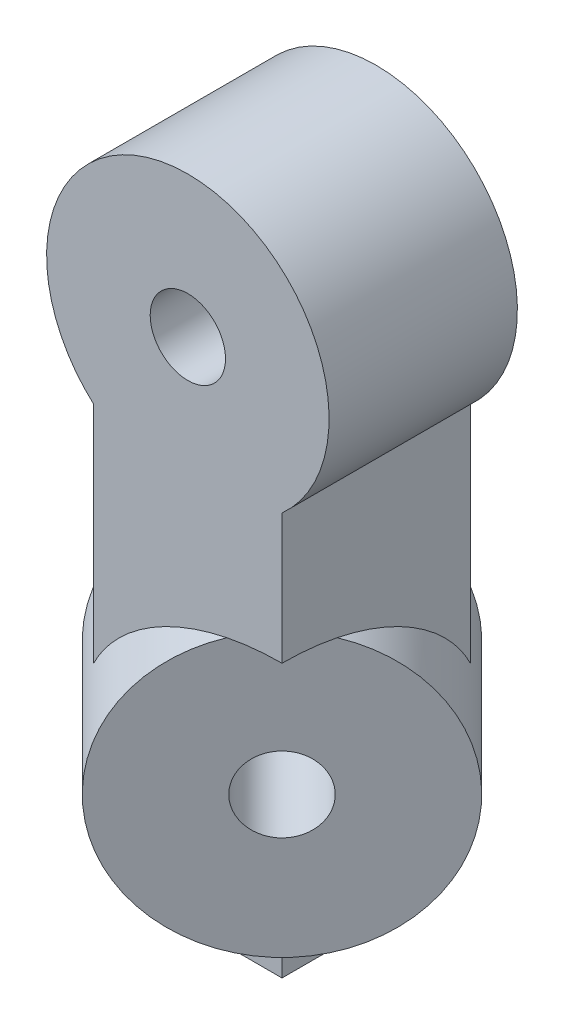
ISO-10303-21;
HEADER;
FILE_DESCRIPTION(('STEP AP214'),'2;1');
FILE_NAME('part.step','',(''),(''),'','','');
FILE_SCHEMA(('AUTOMOTIVE_DESIGN { 1 0 10303 214 1 1 1 1 }'));
ENDSEC;
DATA;
#1=APPLICATION_CONTEXT('core data for automotive mechanical design processes');
#2=APPLICATION_PROTOCOL_DEFINITION('international standard','automotive_design',2000,#1);
#3=PRODUCT_CONTEXT('',#1,'mechanical');
#4=PRODUCT('Part','Part','',(#3));
#5=PRODUCT_RELATED_PRODUCT_CATEGORY('part','',(#4));
#6=PRODUCT_DEFINITION_FORMATION('','',#4);
#7=PRODUCT_DEFINITION_CONTEXT('part definition',#1,'design');
#8=PRODUCT_DEFINITION('design','',#6,#7);
#9=PRODUCT_DEFINITION_SHAPE('','',#8);
#10=(LENGTH_UNIT() NAMED_UNIT(*) SI_UNIT(.MILLI.,.METRE.));
#11=(NAMED_UNIT(*) PLANE_ANGLE_UNIT() SI_UNIT($,.RADIAN.));
#12=(NAMED_UNIT(*) SI_UNIT($,.STERADIAN.) SOLID_ANGLE_UNIT());
#13=UNCERTAINTY_MEASURE_WITH_UNIT(LENGTH_MEASURE(1.E-05),#10,'distance_accuracy_value','');
#14=(GEOMETRIC_REPRESENTATION_CONTEXT(3) GLOBAL_UNCERTAINTY_ASSIGNED_CONTEXT((#13)) GLOBAL_UNIT_ASSIGNED_CONTEXT((#10,
#11,#12)) REPRESENTATION_CONTEXT('',''));
#15=CARTESIAN_POINT('',(0.,0.,0.));
#16=DIRECTION('',(0.,0.,1.));
#17=DIRECTION('',(1.,0.,0.));
#18=AXIS2_PLACEMENT_3D('',#15,#16,#17);
#19=CARTESIAN_POINT('',(-3.5090788794777,-10.0235498921638,1.46446609406726));
#20=DIRECTION('',(0.707106781186547,0.,0.707106781186548));
#21=DIRECTION('',(0.707106781186548,0.,-0.707106781186547));
#22=AXIS2_PLACEMENT_3D('',#19,#20,#21);
#23=CYLINDRICAL_SURFACE('',#22,7.5);
#24=CARTESIAN_POINT('',(-3.5090788794777,-10.0235498921638,1.46446609406726));
#25=DIRECTION('',(-0.707106781186547,0.,-0.707106781186548));
#26=DIRECTION('',(-0.707106781186548,0.,0.707106781186547));
#27=AXIS2_PLACEMENT_3D('',#24,#25,#26);
#28=CIRCLE('',#27,7.5);
#29=CARTESIAN_POINT('',(-2.04461278541044,-2.81517433877762,0.));
#30=VERTEX_POINT('',#29);
#31=CARTESIAN_POINT('',(-4.97354497354497,-2.81517433877762,2.92893218813452));
#32=VERTEX_POINT('',#31);
#33=EDGE_CURVE('E157',#30,#32,#28,.T.);
#34=ORIENTED_EDGE('',*,*,#33,.F.);
#35=CARTESIAN_POINT('',(-4.97354497354496,-10.0235498921638,0.));
#36=DIRECTION('',(0.,0.,1.));
#37=DIRECTION('',(1.,0.,0.));
#38=AXIS2_PLACEMENT_3D('',#35,#36,#37);
#39=ELLIPSE('',#38,10.6066017177982,7.5);
#40=CARTESIAN_POINT('',(5.02645502645504,-7.52354989216375,0.));
#41=VERTEX_POINT('',#40);
#42=EDGE_CURVE('E168',#30,#41,#39,.F.);
#43=ORIENTED_EDGE('',*,*,#42,.T.);
#44=CARTESIAN_POINT('',(5.02645502645504,-10.0235498921638,10.));
#45=DIRECTION('',(-1.,0.,0.));
#46=DIRECTION('',(0.,0.,1.));
#47=AXIS2_PLACEMENT_3D('',#44,#45,#46);
#48=ELLIPSE('',#47,10.6066017177982,7.5);
#49=CARTESIAN_POINT('',(5.02645502645504,-2.81517433877762,7.07106781186548));
#50=VERTEX_POINT('',#49);
#51=EDGE_CURVE('E165',#41,#50,#48,.F.);
#52=ORIENTED_EDGE('',*,*,#51,.T.);
#53=CARTESIAN_POINT('',(3.56198893238777,-10.0235498921638,8.53553390593274));
#54=DIRECTION('',(-0.707106781186547,0.,-0.707106781186548));
#55=DIRECTION('',(-0.707106781186548,0.,0.707106781186547));
#56=AXIS2_PLACEMENT_3D('',#53,#54,#55);
#57=CIRCLE('',#56,7.5);
#58=CARTESIAN_POINT('',(2.09752283832051,-2.81517433877762,10.));
#59=VERTEX_POINT('',#58);
#60=EDGE_CURVE('E156',#50,#59,#57,.T.);
#61=ORIENTED_EDGE('',*,*,#60,.T.);
#62=CARTESIAN_POINT('',(5.02645502645503,-10.0235498921638,10.));
#63=DIRECTION('',(0.,0.,1.));
#64=DIRECTION('',(1.,0.,0.));
#65=AXIS2_PLACEMENT_3D('',#62,#63,#64);
#66=ELLIPSE('',#65,10.6066017177982,7.5);
#67=CARTESIAN_POINT('',(-4.97354497354496,-7.52354989216375,10.));
#68=VERTEX_POINT('',#67);
#69=EDGE_CURVE('E160',#68,#59,#66,.F.);
#70=ORIENTED_EDGE('',*,*,#69,.F.);
#71=CARTESIAN_POINT('',(-4.97354497354496,-10.0235498921638,0.));
#72=DIRECTION('',(1.,0.,0.));
#73=DIRECTION('',(0.,0.,1.));
#74=AXIS2_PLACEMENT_3D('',#71,#72,#73);
#75=ELLIPSE('',#74,10.6066017177982,7.5);
#76=EDGE_CURVE('E197',#68,#32,#75,.F.);
#77=ORIENTED_EDGE('',*,*,#76,.T.);
#78=EDGE_LOOP('',(#34,#43,#52,#61,#70,#77));
#79=FACE_BOUND('',#78,.T.);
#80=CARTESIAN_POINT('',(-1.97354497354496,-10.0235498921638,3.));
#81=DIRECTION('',(1.,0.,0.));
#82=DIRECTION('',(0.,0.,1.));
#83=AXIS2_PLACEMENT_3D('',#80,#81,#82);
#84=ELLIPSE('',#83,10.6066017177982,7.5);
#85=CARTESIAN_POINT('',(-1.97354497354496,-16.9697718868887,7.));
#86=VERTEX_POINT('',#85);
#87=CARTESIAN_POINT('',(-1.97354497354496,-17.5235498921638,3.));
#88=VERTEX_POINT('',#87);
#89=EDGE_CURVE('E11',#86,#88,#84,.T.);
#90=ORIENTED_EDGE('',*,*,#89,.F.);
#91=CARTESIAN_POINT('',(2.02645502645503,-10.0235498921638,7.));
#92=DIRECTION('',(0.,0.,-1.));
#93=DIRECTION('',(1.,0.,0.));
#94=AXIS2_PLACEMENT_3D('',#91,#92,#93);
#95=ELLIPSE('',#94,10.6066017177982,7.5);
#96=CARTESIAN_POINT('',(2.02645502645504,-17.5235498921638,7.));
#97=VERTEX_POINT('',#96);
#98=EDGE_CURVE('E42',#97,#86,#95,.T.);
#99=ORIENTED_EDGE('',*,*,#98,.F.);
#100=CARTESIAN_POINT('',(2.02645502645504,-10.0235498921638,7.));
#101=DIRECTION('',(-1.,0.,0.));
#102=DIRECTION('',(0.,0.,1.));
#103=AXIS2_PLACEMENT_3D('',#100,#101,#102);
#104=ELLIPSE('',#103,10.6066017177982,7.5);
#105=CARTESIAN_POINT('',(2.02645502645504,-16.9697718868887,3.));
#106=VERTEX_POINT('',#105);
#107=EDGE_CURVE('E206',#106,#97,#104,.T.);
#108=ORIENTED_EDGE('',*,*,#107,.F.);
#109=CARTESIAN_POINT('',(-1.97354497354496,-10.0235498921638,3.));
#110=DIRECTION('',(0.,0.,1.));
#111=DIRECTION('',(1.,0.,0.));
#112=AXIS2_PLACEMENT_3D('',#109,#110,#111);
#113=ELLIPSE('',#112,10.6066017177982,7.5);
#114=EDGE_CURVE('E203',#88,#106,#113,.T.);
#115=ORIENTED_EDGE('',*,*,#114,.F.);
#116=EDGE_LOOP('',(#90,#99,#108,#115));
#117=FACE_BOUND('',#116,.T.);
#118=ADVANCED_FACE('F34',(#79,#117),#23,.T.);
#119=CARTESIAN_POINT('',(9.21884318188016,-10.0235498921638,14.1923881554251));
#120=DIRECTION('',(-0.707106781186548,0.,-0.707106781186548));
#121=DIRECTION('',(-0.707106781186548,0.,0.707106781186548));
#122=AXIS2_PLACEMENT_3D('',#119,#120,#121);
#123=CYLINDRICAL_SURFACE('',#122,2.);
#124=CARTESIAN_POINT('',(3.56198893238777,-10.0235498921638,8.53553390593274));
#125=DIRECTION('',(-0.707106781186547,0.,-0.707106781186548));
#126=DIRECTION('',(-0.707106781186548,0.,0.707106781186547));
#127=AXIS2_PLACEMENT_3D('',#124,#125,#126);
#128=CIRCLE('',#127,2.);
#129=CARTESIAN_POINT('',(2.14777537001468,-10.0235498921638,9.94974746830583));
#130=VERTEX_POINT('',#129);
#131=EDGE_CURVE('E200',#130,#130,#128,.T.);
#132=ORIENTED_EDGE('',*,*,#131,.F.);
#133=EDGE_LOOP('',(#132));
#134=FACE_BOUND('',#133,.T.);
#135=CARTESIAN_POINT('',(-3.5090788794777,-10.0235498921638,1.46446609406726));
#136=DIRECTION('',(-0.707106781186547,0.,-0.707106781186548));
#137=DIRECTION('',(-0.707106781186548,0.,0.707106781186547));
#138=AXIS2_PLACEMENT_3D('',#135,#136,#137);
#139=CIRCLE('',#138,2.);
#140=CARTESIAN_POINT('',(-4.9232924418508,-10.0235498921638,2.87867965644035));
#141=VERTEX_POINT('',#140);
#142=EDGE_CURVE('E153',#141,#141,#139,.T.);
#143=ORIENTED_EDGE('',*,*,#142,.T.);
#144=EDGE_LOOP('',(#143));
#145=FACE_BOUND('',#144,.T.);
#146=ADVANCED_FACE('F221',(#134,#145),#123,.F.);
#147=CARTESIAN_POINT('',(0.0264550264550368,9.97645010783625,10.));
#148=DIRECTION('',(0.,0.,1.));
#149=DIRECTION('',(1.,0.,0.));
#150=AXIS2_PLACEMENT_3D('',#147,#148,#149);
#151=PLANE('',#150);
#152=CARTESIAN_POINT('',(0.0264550264550368,9.97645010783625,10.));
#153=DIRECTION('',(0.,0.,1.));
#154=DIRECTION('',(1.,0.,0.));
#155=AXIS2_PLACEMENT_3D('',#152,#153,#154);
#156=CIRCLE('',#155,2.);
#157=CARTESIAN_POINT('',(2.02645502645504,9.97645010783625,10.));
#158=VERTEX_POINT('',#157);
#159=EDGE_CURVE('E174',#158,#158,#156,.T.);
#160=ORIENTED_EDGE('',*,*,#159,.F.);
#161=EDGE_LOOP('',(#160));
#162=FACE_BOUND('',#161,.T.);
#163=ORIENTED_EDGE('',*,*,#69,.T.);
#164=CARTESIAN_POINT('',(5.02645502645503,-10.0235498921638,10.));
#165=DIRECTION('',(0.,0.,1.));
#166=DIRECTION('',(-1.,0.,0.));
#167=AXIS2_PLACEMENT_3D('',#164,#165,#166);
#168=ELLIPSE('',#167,10.6066017177982,7.5);
#169=CARTESIAN_POINT('',(5.02645502645504,-2.52354989216375,10.));
#170=VERTEX_POINT('',#169);
#171=EDGE_CURVE('E150',#59,#170,#168,.F.);
#172=ORIENTED_EDGE('',*,*,#171,.T.);
#173=DIRECTION('',(0.,1.,0.));
#174=VECTOR('',#173,1.);
#175=CARTESIAN_POINT('',(5.02645502645504,-10.0235498921638,10.));
#176=LINE('',#175,#174);
#177=CARTESIAN_POINT('',(5.02645502645504,4.38628016408677,10.));
#178=VERTEX_POINT('',#177);
#179=EDGE_CURVE('E178',#170,#178,#176,.T.);
#180=ORIENTED_EDGE('',*,*,#179,.T.);
#181=CARTESIAN_POINT('',(0.0264550264550368,9.97645010783625,10.));
#182=DIRECTION('',(0.,0.,1.));
#183=DIRECTION('',(1.,0.,0.));
#184=AXIS2_PLACEMENT_3D('',#181,#182,#183);
#185=CIRCLE('',#184,7.5);
#186=CARTESIAN_POINT('',(-4.97354497354496,4.38628016408677,10.));
#187=VERTEX_POINT('',#186);
#188=EDGE_CURVE('E180',#178,#187,#185,.T.);
#189=ORIENTED_EDGE('',*,*,#188,.T.);
#190=DIRECTION('',(0.,-1.,0.));
#191=VECTOR('',#190,1.);
#192=CARTESIAN_POINT('',(-4.97354497354496,-10.0235498921638,10.));
#193=LINE('',#192,#191);
#194=EDGE_CURVE('E183',#187,#68,#193,.T.);
#195=ORIENTED_EDGE('',*,*,#194,.T.);
#196=EDGE_LOOP('',(#163,#172,#180,#189,#195));
#197=FACE_BOUND('',#196,.T.);
#198=ADVANCED_FACE('F227',(#162,#197),#151,.T.);
#199=CARTESIAN_POINT('',(5.02645502645504,-10.0235498921638,10.));
#200=DIRECTION('',(-1.,0.,0.));
#201=DIRECTION('',(0.,0.,1.));
#202=AXIS2_PLACEMENT_3D('',#199,#200,#201);
#203=PLANE('',#202);
#204=CARTESIAN_POINT('',(5.02645502645504,-10.0235498921638,10.));
#205=DIRECTION('',(-1.,0.,0.));
#206=DIRECTION('',(0.,0.,-1.));
#207=AXIS2_PLACEMENT_3D('',#204,#205,#206);
#208=ELLIPSE('',#207,10.6066017177982,7.5);
#209=EDGE_CURVE('E148',#50,#170,#208,.F.);
#210=ORIENTED_EDGE('',*,*,#209,.F.);
#211=ORIENTED_EDGE('',*,*,#51,.F.);
#212=DIRECTION('',(0.,1.,0.));
#213=VECTOR('',#212,1.);
#214=CARTESIAN_POINT('',(5.02645502645504,-10.0235498921638,0.));
#215=LINE('',#214,#213);
#216=CARTESIAN_POINT('',(5.02645502645504,4.38628016408677,0.));
#217=VERTEX_POINT('',#216);
#218=EDGE_CURVE('E177',#41,#217,#215,.T.);
#219=ORIENTED_EDGE('',*,*,#218,.T.);
#220=DIRECTION('',(0.,0.,-1.));
#221=VECTOR('',#220,1.);
#222=CARTESIAN_POINT('',(5.02645502645504,4.38628016408677,10.));
#223=LINE('',#222,#221);
#224=EDGE_CURVE('E194',#178,#217,#223,.T.);
#225=ORIENTED_EDGE('',*,*,#224,.F.);
#226=ORIENTED_EDGE('',*,*,#179,.F.);
#227=EDGE_LOOP('',(#210,#211,#219,#225,#226));
#228=FACE_BOUND('',#227,.T.);
#229=ADVANCED_FACE('F36',(#228),#203,.F.);
#230=CARTESIAN_POINT('',(0.0264550264550368,9.97645010783625,0.));
#231=DIRECTION('',(0.,0.,1.));
#232=DIRECTION('',(1.,0.,0.));
#233=AXIS2_PLACEMENT_3D('',#230,#231,#232);
#234=PLANE('',#233);
#235=CARTESIAN_POINT('',(0.0264550264550368,9.97645010783625,0.));
#236=DIRECTION('',(0.,0.,-1.));
#237=DIRECTION('',(-1.,0.,0.));
#238=AXIS2_PLACEMENT_3D('',#235,#236,#237);
#239=CIRCLE('',#238,2.);
#240=CARTESIAN_POINT('',(-1.97354497354496,9.97645010783625,0.));
#241=VERTEX_POINT('',#240);
#242=EDGE_CURVE('E171',#241,#241,#239,.T.);
#243=ORIENTED_EDGE('',*,*,#242,.F.);
#244=EDGE_LOOP('',(#243));
#245=FACE_BOUND('',#244,.T.);
#246=ORIENTED_EDGE('',*,*,#42,.F.);
#247=CARTESIAN_POINT('',(-4.97354497354496,-10.0235498921638,0.));
#248=DIRECTION('',(0.,0.,1.));
#249=DIRECTION('',(1.,0.,0.));
#250=AXIS2_PLACEMENT_3D('',#247,#248,#249);
#251=ELLIPSE('',#250,10.6066017177982,7.5);
#252=CARTESIAN_POINT('',(-4.97354497354496,-2.52354989216375,0.));
#253=VERTEX_POINT('',#252);
#254=EDGE_CURVE('E142',#30,#253,#251,.T.);
#255=ORIENTED_EDGE('',*,*,#254,.T.);
#256=DIRECTION('',(0.,-1.,0.));
#257=VECTOR('',#256,1.);
#258=CARTESIAN_POINT('',(-4.97354497354496,-10.0235498921638,0.));
#259=LINE('',#258,#257);
#260=CARTESIAN_POINT('',(-4.97354497354496,4.38628016408677,0.));
#261=VERTEX_POINT('',#260);
#262=EDGE_CURVE('E181',#261,#253,#259,.T.);
#263=ORIENTED_EDGE('',*,*,#262,.F.);
#264=CARTESIAN_POINT('',(0.0264550264550368,9.97645010783625,0.));
#265=DIRECTION('',(0.,0.,1.));
#266=DIRECTION('',(1.,0.,0.));
#267=AXIS2_PLACEMENT_3D('',#264,#265,#266);
#268=CIRCLE('',#267,7.5);
#269=EDGE_CURVE('E188',#217,#261,#268,.T.);
#270=ORIENTED_EDGE('',*,*,#269,.F.);
#271=ORIENTED_EDGE('',*,*,#218,.F.);
#272=EDGE_LOOP('',(#246,#255,#263,#270,#271));
#273=FACE_BOUND('',#272,.T.);
#274=ADVANCED_FACE('F244',(#245,#273),#234,.F.);
#275=CARTESIAN_POINT('',(-4.97354497354496,-10.0235498921638,10.));
#276=DIRECTION('',(1.,0.,0.));
#277=DIRECTION('',(0.,0.,-1.));
#278=AXIS2_PLACEMENT_3D('',#275,#276,#277);
#279=PLANE('',#278);
#280=ORIENTED_EDGE('',*,*,#262,.T.);
#281=CARTESIAN_POINT('',(-4.97354497354496,-10.0235498921638,0.));
#282=DIRECTION('',(1.,0.,0.));
#283=DIRECTION('',(0.,0.,1.));
#284=AXIS2_PLACEMENT_3D('',#281,#282,#283);
#285=ELLIPSE('',#284,10.6066017177982,7.5);
#286=EDGE_CURVE('E139',#253,#32,#285,.T.);
#287=ORIENTED_EDGE('',*,*,#286,.T.);
#288=ORIENTED_EDGE('',*,*,#76,.F.);
#289=ORIENTED_EDGE('',*,*,#194,.F.);
#290=DIRECTION('',(0.,0.,-1.));
#291=VECTOR('',#290,1.);
#292=CARTESIAN_POINT('',(-4.97354497354496,4.38628016408677,10.));
#293=LINE('',#292,#291);
#294=EDGE_CURVE('E186',#187,#261,#293,.T.);
#295=ORIENTED_EDGE('',*,*,#294,.T.);
#296=EDGE_LOOP('',(#280,#287,#288,#289,#295));
#297=FACE_BOUND('',#296,.T.);
#298=ADVANCED_FACE('F247',(#297),#279,.F.);
#299=CARTESIAN_POINT('',(0.0264550264550368,9.97645010783625,10.));
#300=DIRECTION('',(0.,0.,-1.));
#301=DIRECTION('',(-1.,0.,0.));
#302=AXIS2_PLACEMENT_3D('',#299,#300,#301);
#303=CYLINDRICAL_SURFACE('',#302,7.5);
#304=ORIENTED_EDGE('',*,*,#269,.T.);
#305=ORIENTED_EDGE('',*,*,#294,.F.);
#306=ORIENTED_EDGE('',*,*,#188,.F.);
#307=ORIENTED_EDGE('',*,*,#224,.T.);
#308=EDGE_LOOP('',(#304,#305,#306,#307));
#309=FACE_BOUND('',#308,.T.);
#310=ADVANCED_FACE('F239',(#309),#303,.T.);
#311=CARTESIAN_POINT('',(0.0264550264550368,9.97645010783625,30.));
#312=DIRECTION('',(0.,0.,-1.));
#313=DIRECTION('',(-1.,0.,0.));
#314=AXIS2_PLACEMENT_3D('',#311,#312,#313);
#315=CYLINDRICAL_SURFACE('',#314,2.);
#316=ORIENTED_EDGE('',*,*,#159,.T.);
#317=EDGE_LOOP('',(#316));
#318=FACE_BOUND('',#317,.T.);
#319=ORIENTED_EDGE('',*,*,#242,.T.);
#320=EDGE_LOOP('',(#319));
#321=FACE_BOUND('',#320,.T.);
#322=ADVANCED_FACE('F235',(#318,#321),#315,.F.);
#323=CARTESIAN_POINT('',(-3.5090788794777,-10.0235498921638,1.46446609406726));
#324=DIRECTION('',(-0.707106781186547,0.,-0.707106781186548));
#325=DIRECTION('',(-0.707106781186548,0.,0.707106781186547));
#326=AXIS2_PLACEMENT_3D('',#323,#324,#325);
#327=PLANE('',#326);
#328=ORIENTED_EDGE('',*,*,#142,.F.);
#329=EDGE_LOOP('',(#328));
#330=FACE_BOUND('',#329,.T.);
#331=ORIENTED_EDGE('',*,*,#33,.T.);
#332=CARTESIAN_POINT('',(-3.5090788794777,-10.0235498921638,1.46446609406726));
#333=DIRECTION('',(0.707106781186547,0.,0.707106781186548));
#334=DIRECTION('',(0.707106781186548,0.,-0.707106781186547));
#335=AXIS2_PLACEMENT_3D('',#332,#333,#334);
#336=CIRCLE('',#335,7.5);
#337=EDGE_CURVE('E114',#30,#32,#336,.T.);
#338=ORIENTED_EDGE('',*,*,#337,.F.);
#339=EDGE_LOOP('',(#331,#338));
#340=FACE_BOUND('',#339,.T.);
#341=ADVANCED_FACE('F238',(#330,#340),#327,.T.);
#342=CARTESIAN_POINT('',(3.56198893238777,-10.0235498921638,8.53553390593274));
#343=DIRECTION('',(-0.707106781186547,0.,-0.707106781186548));
#344=DIRECTION('',(-0.707106781186548,0.,0.707106781186547));
#345=AXIS2_PLACEMENT_3D('',#342,#343,#344);
#346=PLANE('',#345);
#347=ORIENTED_EDGE('',*,*,#131,.T.);
#348=EDGE_LOOP('',(#347));
#349=FACE_BOUND('',#348,.T.);
#350=ORIENTED_EDGE('',*,*,#60,.F.);
#351=CARTESIAN_POINT('',(3.56198893238778,-10.0235498921638,8.53553390593274));
#352=DIRECTION('',(0.707106781186548,0.,0.707106781186548));
#353=DIRECTION('',(0.707106781186548,0.,-0.707106781186548));
#354=AXIS2_PLACEMENT_3D('',#351,#352,#353);
#355=CIRCLE('',#354,7.5);
#356=EDGE_CURVE('E145',#50,#59,#355,.T.);
#357=ORIENTED_EDGE('',*,*,#356,.T.);
#358=EDGE_LOOP('',(#350,#357));
#359=FACE_BOUND('',#358,.T.);
#360=ADVANCED_FACE('F233',(#349,#359),#346,.F.);
#361=CARTESIAN_POINT('',(9.92594996306671,-10.0235498921638,14.8994949366117));
#362=DIRECTION('',(-0.707106781186548,0.,-0.707106781186548));
#363=DIRECTION('',(-0.707106781186548,0.,0.707106781186548));
#364=AXIS2_PLACEMENT_3D('',#361,#362,#363);
#365=CYLINDRICAL_SURFACE('',#364,7.5);
#366=ORIENTED_EDGE('',*,*,#356,.F.);
#367=ORIENTED_EDGE('',*,*,#209,.T.);
#368=ORIENTED_EDGE('',*,*,#171,.F.);
#369=EDGE_LOOP('',(#366,#367,#368));
#370=FACE_BOUND('',#369,.T.);
#371=ADVANCED_FACE('F276',(#370),#365,.F.);
#372=CARTESIAN_POINT('',(-9.87303991015663,-10.0235498921638,-4.89949493661168));
#373=DIRECTION('',(0.707106781186547,0.,0.707106781186548));
#374=DIRECTION('',(0.707106781186548,0.,-0.707106781186547));
#375=AXIS2_PLACEMENT_3D('',#372,#373,#374);
#376=CYLINDRICAL_SURFACE('',#375,7.5);
#377=ORIENTED_EDGE('',*,*,#337,.T.);
#378=ORIENTED_EDGE('',*,*,#286,.F.);
#379=ORIENTED_EDGE('',*,*,#254,.F.);
#380=EDGE_LOOP('',(#377,#378,#379));
#381=FACE_BOUND('',#380,.T.);
#382=ADVANCED_FACE('F266',(#381),#376,.F.);
#383=CARTESIAN_POINT('',(-1.97354497354496,-15.,3.));
#384=DIRECTION('',(1.,0.,0.));
#385=DIRECTION('',(0.,0.,-1.));
#386=AXIS2_PLACEMENT_3D('',#383,#384,#385);
#387=PLANE('',#386);
#388=DIRECTION('',(0.,-1.,0.));
#389=VECTOR('',#388,1.);
#390=CARTESIAN_POINT('',(-1.97354497354496,-15.,7.));
#391=LINE('',#390,#389);
#392=CARTESIAN_POINT('',(-1.97354497354496,-20.,7.));
#393=VERTEX_POINT('',#392);
#394=EDGE_CURVE('E106',#86,#393,#391,.T.);
#395=ORIENTED_EDGE('',*,*,#394,.F.);
#396=ORIENTED_EDGE('',*,*,#89,.T.);
#397=DIRECTION('',(0.,-1.,0.));
#398=VECTOR('',#397,1.);
#399=CARTESIAN_POINT('',(-1.97354497354496,-15.,3.));
#400=LINE('',#399,#398);
#401=CARTESIAN_POINT('',(-1.97354497354496,-20.,3.));
#402=VERTEX_POINT('',#401);
#403=EDGE_CURVE('E127',#88,#402,#400,.T.);
#404=ORIENTED_EDGE('',*,*,#403,.T.);
#405=DIRECTION('',(0.,0.,1.));
#406=VECTOR('',#405,1.);
#407=CARTESIAN_POINT('',(-1.97354497354496,-20.,3.));
#408=LINE('',#407,#406);
#409=EDGE_CURVE('E121',#402,#393,#408,.T.);
#410=ORIENTED_EDGE('',*,*,#409,.T.);
#411=EDGE_LOOP('',(#395,#396,#404,#410));
#412=FACE_BOUND('',#411,.T.);
#413=ADVANCED_FACE('F125',(#412),#387,.F.);
#414=CARTESIAN_POINT('',(2.02645502645504,-15.,7.));
#415=DIRECTION('',(0.,0.,-1.));
#416=DIRECTION('',(-1.,0.,0.));
#417=AXIS2_PLACEMENT_3D('',#414,#415,#416);
#418=PLANE('',#417);
#419=DIRECTION('',(0.,-1.,0.));
#420=VECTOR('',#419,1.);
#421=CARTESIAN_POINT('',(2.02645502645504,-15.,7.));
#422=LINE('',#421,#420);
#423=CARTESIAN_POINT('',(2.02645502645504,-20.,7.));
#424=VERTEX_POINT('',#423);
#425=EDGE_CURVE('E115',#97,#424,#422,.T.);
#426=ORIENTED_EDGE('',*,*,#425,.F.);
#427=ORIENTED_EDGE('',*,*,#98,.T.);
#428=ORIENTED_EDGE('',*,*,#394,.T.);
#429=DIRECTION('',(1.,0.,0.));
#430=VECTOR('',#429,1.);
#431=CARTESIAN_POINT('',(2.02645502645504,-20.,7.));
#432=LINE('',#431,#430);
#433=EDGE_CURVE('E110',#393,#424,#432,.T.);
#434=ORIENTED_EDGE('',*,*,#433,.T.);
#435=EDGE_LOOP('',(#426,#427,#428,#434));
#436=FACE_BOUND('',#435,.T.);
#437=ADVANCED_FACE('F109',(#436),#418,.F.);
#438=CARTESIAN_POINT('',(2.02645502645504,-15.,3.));
#439=DIRECTION('',(-1.,0.,0.));
#440=DIRECTION('',(0.,0.,1.));
#441=AXIS2_PLACEMENT_3D('',#438,#439,#440);
#442=PLANE('',#441);
#443=DIRECTION('',(0.,-1.,0.));
#444=VECTOR('',#443,1.);
#445=CARTESIAN_POINT('',(2.02645502645504,-15.,3.));
#446=LINE('',#445,#444);
#447=CARTESIAN_POINT('',(2.02645502645504,-20.,3.));
#448=VERTEX_POINT('',#447);
#449=EDGE_CURVE('E135',#106,#448,#446,.T.);
#450=ORIENTED_EDGE('',*,*,#449,.F.);
#451=ORIENTED_EDGE('',*,*,#107,.T.);
#452=ORIENTED_EDGE('',*,*,#425,.T.);
#453=DIRECTION('',(0.,0.,-1.));
#454=VECTOR('',#453,1.);
#455=CARTESIAN_POINT('',(2.02645502645504,-20.,3.));
#456=LINE('',#455,#454);
#457=EDGE_CURVE('E123',#424,#448,#456,.T.);
#458=ORIENTED_EDGE('',*,*,#457,.T.);
#459=EDGE_LOOP('',(#450,#451,#452,#458));
#460=FACE_BOUND('',#459,.T.);
#461=ADVANCED_FACE('F209',(#460),#442,.F.);
#462=CARTESIAN_POINT('',(2.02645502645504,-15.,3.));
#463=DIRECTION('',(0.,0.,1.));
#464=DIRECTION('',(1.,0.,0.));
#465=AXIS2_PLACEMENT_3D('',#462,#463,#464);
#466=PLANE('',#465);
#467=ORIENTED_EDGE('',*,*,#403,.F.);
#468=ORIENTED_EDGE('',*,*,#114,.T.);
#469=ORIENTED_EDGE('',*,*,#449,.T.);
#470=DIRECTION('',(-1.,0.,0.));
#471=VECTOR('',#470,1.);
#472=CARTESIAN_POINT('',(2.02645502645504,-20.,3.));
#473=LINE('',#472,#471);
#474=EDGE_CURVE('E132',#448,#402,#473,.T.);
#475=ORIENTED_EDGE('',*,*,#474,.T.);
#476=EDGE_LOOP('',(#467,#468,#469,#475));
#477=FACE_BOUND('',#476,.T.);
#478=ADVANCED_FACE('F211',(#477),#466,.F.);
#479=CARTESIAN_POINT('',(0.,-20.,0.));
#480=DIRECTION('',(0.,-1.,0.));
#481=DIRECTION('',(0.,0.,-1.));
#482=AXIS2_PLACEMENT_3D('',#479,#480,#481);
#483=PLANE('',#482);
#484=ORIENTED_EDGE('',*,*,#409,.F.);
#485=ORIENTED_EDGE('',*,*,#474,.F.);
#486=ORIENTED_EDGE('',*,*,#457,.F.);
#487=ORIENTED_EDGE('',*,*,#433,.F.);
#488=EDGE_LOOP('',(#484,#485,#486,#487));
#489=FACE_BOUND('',#488,.T.);
#490=ADVANCED_FACE('F119',(#489),#483,.T.);
#491=CLOSED_SHELL('',(#118,#146,#198,#229,#274,#298,#310,#322,#341,#360,#371,#382,#413,#437,
#461,#478,#490));
#492=MANIFOLD_SOLID_BREP('B2',#491);
#493=ADVANCED_BREP_SHAPE_REPRESENTATION('',(#18,#492),#14);
#494=SHAPE_DEFINITION_REPRESENTATION(#9,#493);
ENDSEC;
END-ISO-10303-21;
